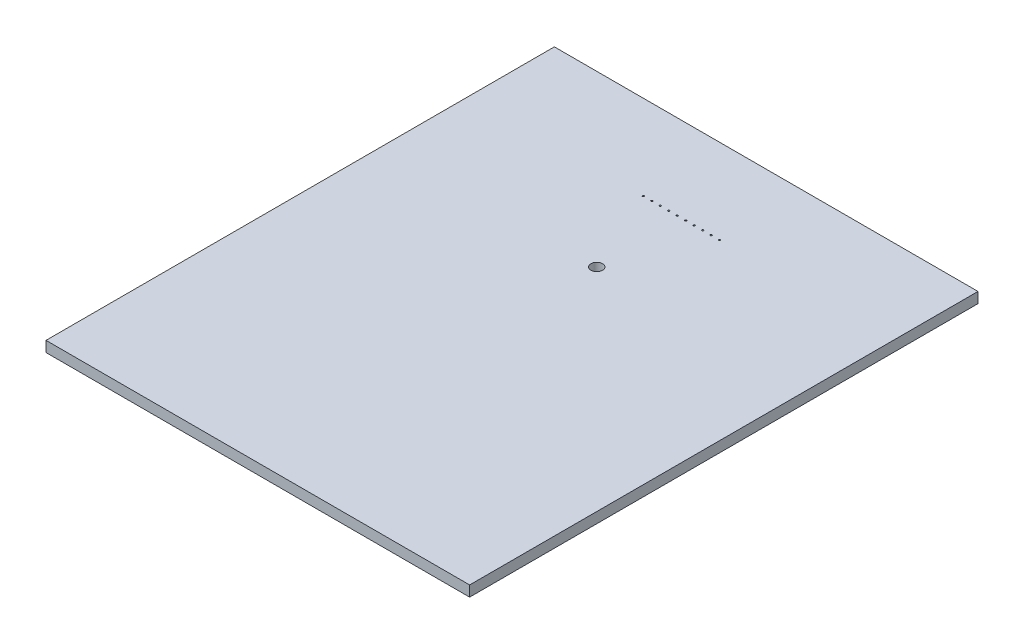
ISO-10303-21;
HEADER;
FILE_DESCRIPTION(('STEP AP214'),'2;1');
FILE_NAME('part.step','',(''),(''),'','','');
FILE_SCHEMA(('AUTOMOTIVE_DESIGN { 1 0 10303 214 1 1 1 1 }'));
ENDSEC;
DATA;
#1=APPLICATION_CONTEXT('core data for automotive mechanical design processes');
#2=APPLICATION_PROTOCOL_DEFINITION('international standard','automotive_design',2000,#1);
#3=PRODUCT_CONTEXT('',#1,'mechanical');
#4=PRODUCT('Part','Part','',(#3));
#5=PRODUCT_RELATED_PRODUCT_CATEGORY('part','',(#4));
#6=PRODUCT_DEFINITION_FORMATION('','',#4);
#7=PRODUCT_DEFINITION_CONTEXT('part definition',#1,'design');
#8=PRODUCT_DEFINITION('design','',#6,#7);
#9=PRODUCT_DEFINITION_SHAPE('','',#8);
#10=(LENGTH_UNIT() NAMED_UNIT(*) SI_UNIT(.MILLI.,.METRE.));
#11=(NAMED_UNIT(*) PLANE_ANGLE_UNIT() SI_UNIT($,.RADIAN.));
#12=(NAMED_UNIT(*) SI_UNIT($,.STERADIAN.) SOLID_ANGLE_UNIT());
#13=UNCERTAINTY_MEASURE_WITH_UNIT(LENGTH_MEASURE(1.E-05),#10,'distance_accuracy_value','');
#14=(GEOMETRIC_REPRESENTATION_CONTEXT(3) GLOBAL_UNCERTAINTY_ASSIGNED_CONTEXT((#13)) GLOBAL_UNIT_ASSIGNED_CONTEXT((#10,
#11,#12)) REPRESENTATION_CONTEXT('',''));
#15=CARTESIAN_POINT('',(0.,0.,0.));
#16=DIRECTION('',(0.,0.,1.));
#17=DIRECTION('',(1.,0.,0.));
#18=AXIS2_PLACEMENT_3D('',#15,#16,#17);
#19=CARTESIAN_POINT('',(0.,3.175,0.));
#20=DIRECTION('',(1.,0.,0.));
#21=DIRECTION('',(0.,0.,-1.));
#22=AXIS2_PLACEMENT_3D('',#19,#20,#21);
#23=PLANE('',#22);
#24=DIRECTION('',(0.,0.,1.));
#25=VECTOR('',#24,1.);
#26=CARTESIAN_POINT('',(0.,0.,0.));
#27=LINE('',#26,#25);
#28=CARTESIAN_POINT('',(0.,0.,-152.4));
#29=VERTEX_POINT('',#28);
#30=CARTESIAN_POINT('',(0.,0.,0.));
#31=VERTEX_POINT('',#30);
#32=EDGE_CURVE('E98',#29,#31,#27,.T.);
#33=ORIENTED_EDGE('',*,*,#32,.T.);
#34=DIRECTION('',(0.,-1.,0.));
#35=VECTOR('',#34,1.);
#36=CARTESIAN_POINT('',(0.,3.175,0.));
#37=LINE('',#36,#35);
#38=CARTESIAN_POINT('',(0.,3.175,0.));
#39=VERTEX_POINT('',#38);
#40=EDGE_CURVE('E11',#39,#31,#37,.T.);
#41=ORIENTED_EDGE('',*,*,#40,.F.);
#42=DIRECTION('',(0.,0.,1.));
#43=VECTOR('',#42,1.);
#44=CARTESIAN_POINT('',(0.,3.175,0.));
#45=LINE('',#44,#43);
#46=CARTESIAN_POINT('',(0.,3.175,-152.4));
#47=VERTEX_POINT('',#46);
#48=EDGE_CURVE('E86',#47,#39,#45,.T.);
#49=ORIENTED_EDGE('',*,*,#48,.F.);
#50=DIRECTION('',(0.,-1.,0.));
#51=VECTOR('',#50,1.);
#52=CARTESIAN_POINT('',(0.,3.175,-152.4));
#53=LINE('',#52,#51);
#54=EDGE_CURVE('E94',#47,#29,#53,.T.);
#55=ORIENTED_EDGE('',*,*,#54,.T.);
#56=EDGE_LOOP('',(#33,#41,#49,#55));
#57=FACE_BOUND('',#56,.T.);
#58=ADVANCED_FACE('F35',(#57),#23,.F.);
#59=CARTESIAN_POINT('',(0.,3.175,0.));
#60=DIRECTION('',(0.,0.,-1.));
#61=DIRECTION('',(-1.,0.,0.));
#62=AXIS2_PLACEMENT_3D('',#59,#60,#61);
#63=PLANE('',#62);
#64=DIRECTION('',(1.,0.,0.));
#65=VECTOR('',#64,1.);
#66=CARTESIAN_POINT('',(0.,0.,0.));
#67=LINE('',#66,#65);
#68=CARTESIAN_POINT('',(127.,0.,0.));
#69=VERTEX_POINT('',#68);
#70=EDGE_CURVE('E90',#31,#69,#67,.T.);
#71=ORIENTED_EDGE('',*,*,#70,.T.);
#72=DIRECTION('',(0.,-1.,0.));
#73=VECTOR('',#72,1.);
#74=CARTESIAN_POINT('',(127.,3.175,0.));
#75=LINE('',#74,#73);
#76=CARTESIAN_POINT('',(127.,3.175,0.));
#77=VERTEX_POINT('',#76);
#78=EDGE_CURVE('E43',#77,#69,#75,.T.);
#79=ORIENTED_EDGE('',*,*,#78,.F.);
#80=DIRECTION('',(1.,0.,0.));
#81=VECTOR('',#80,1.);
#82=CARTESIAN_POINT('',(0.,3.175,0.));
#83=LINE('',#82,#81);
#84=EDGE_CURVE('E81',#39,#77,#83,.T.);
#85=ORIENTED_EDGE('',*,*,#84,.F.);
#86=ORIENTED_EDGE('',*,*,#40,.T.);
#87=EDGE_LOOP('',(#71,#79,#85,#86));
#88=FACE_BOUND('',#87,.T.);
#89=ADVANCED_FACE('F89',(#88),#63,.F.);
#90=CARTESIAN_POINT('',(127.,3.175,0.));
#91=DIRECTION('',(-1.,0.,0.));
#92=DIRECTION('',(0.,0.,1.));
#93=AXIS2_PLACEMENT_3D('',#90,#91,#92);
#94=PLANE('',#93);
#95=DIRECTION('',(0.,0.,-1.));
#96=VECTOR('',#95,1.);
#97=CARTESIAN_POINT('',(127.,0.,0.));
#98=LINE('',#97,#96);
#99=CARTESIAN_POINT('',(127.,0.,-152.4));
#100=VERTEX_POINT('',#99);
#101=EDGE_CURVE('E68',#69,#100,#98,.T.);
#102=ORIENTED_EDGE('',*,*,#101,.T.);
#103=DIRECTION('',(0.,-1.,0.));
#104=VECTOR('',#103,1.);
#105=CARTESIAN_POINT('',(127.,3.175,-152.4));
#106=LINE('',#105,#104);
#107=CARTESIAN_POINT('',(127.,3.175,-152.4));
#108=VERTEX_POINT('',#107);
#109=EDGE_CURVE('E91',#108,#100,#106,.T.);
#110=ORIENTED_EDGE('',*,*,#109,.F.);
#111=DIRECTION('',(0.,0.,-1.));
#112=VECTOR('',#111,1.);
#113=CARTESIAN_POINT('',(127.,3.175,0.));
#114=LINE('',#113,#112);
#115=EDGE_CURVE('E84',#77,#108,#114,.T.);
#116=ORIENTED_EDGE('',*,*,#115,.F.);
#117=ORIENTED_EDGE('',*,*,#78,.T.);
#118=EDGE_LOOP('',(#102,#110,#116,#117));
#119=FACE_BOUND('',#118,.T.);
#120=ADVANCED_FACE('F92',(#119),#94,.F.);
#121=CARTESIAN_POINT('',(0.,3.175,-152.4));
#122=DIRECTION('',(0.,0.,1.));
#123=DIRECTION('',(1.,0.,0.));
#124=AXIS2_PLACEMENT_3D('',#121,#122,#123);
#125=PLANE('',#124);
#126=DIRECTION('',(-1.,0.,0.));
#127=VECTOR('',#126,1.);
#128=CARTESIAN_POINT('',(0.,0.,-152.4));
#129=LINE('',#128,#127);
#130=EDGE_CURVE('E74',#100,#29,#129,.T.);
#131=ORIENTED_EDGE('',*,*,#130,.T.);
#132=ORIENTED_EDGE('',*,*,#54,.F.);
#133=DIRECTION('',(-1.,0.,0.));
#134=VECTOR('',#133,1.);
#135=CARTESIAN_POINT('',(0.,3.175,-152.4));
#136=LINE('',#135,#134);
#137=EDGE_CURVE('E51',#108,#47,#136,.T.);
#138=ORIENTED_EDGE('',*,*,#137,.F.);
#139=ORIENTED_EDGE('',*,*,#109,.T.);
#140=EDGE_LOOP('',(#131,#132,#138,#139));
#141=FACE_BOUND('',#140,.T.);
#142=ADVANCED_FACE('F106',(#141),#125,.F.);
#143=CARTESIAN_POINT('',(0.,3.175,0.));
#144=DIRECTION('',(0.,-1.,0.));
#145=DIRECTION('',(0.,0.,-1.));
#146=AXIS2_PLACEMENT_3D('',#143,#144,#145);
#147=PLANE('',#146);
#148=CARTESIAN_POINT('',(52.07,3.175,-127.));
#149=DIRECTION('',(0.,1.,0.));
#150=DIRECTION('',(0.,0.,1.));
#151=AXIS2_PLACEMENT_3D('',#148,#149,#150);
#152=CIRCLE('',#151,0.246300585078375);
#153=CARTESIAN_POINT('',(52.07,3.175,-126.753699414922));
#154=VERTEX_POINT('',#153);
#155=EDGE_CURVE('E172',#154,#154,#152,.T.);
#156=ORIENTED_EDGE('',*,*,#155,.F.);
#157=EDGE_LOOP('',(#156));
#158=FACE_BOUND('',#157,.T.);
#159=CARTESIAN_POINT('',(54.61,3.175,-127.));
#160=DIRECTION('',(0.,1.,0.));
#161=DIRECTION('',(0.,0.,1.));
#162=AXIS2_PLACEMENT_3D('',#159,#160,#161);
#163=CIRCLE('',#162,0.246300585078375);
#164=CARTESIAN_POINT('',(54.61,3.175,-126.753699414922));
#165=VERTEX_POINT('',#164);
#166=EDGE_CURVE('E166',#165,#165,#163,.T.);
#167=ORIENTED_EDGE('',*,*,#166,.F.);
#168=EDGE_LOOP('',(#167));
#169=FACE_BOUND('',#168,.T.);
#170=CARTESIAN_POINT('',(57.15,3.175,-127.));
#171=DIRECTION('',(0.,1.,0.));
#172=DIRECTION('',(0.,0.,1.));
#173=AXIS2_PLACEMENT_3D('',#170,#171,#172);
#174=CIRCLE('',#173,0.246300585078375);
#175=CARTESIAN_POINT('',(57.15,3.175,-126.753699414922));
#176=VERTEX_POINT('',#175);
#177=EDGE_CURVE('E160',#176,#176,#174,.T.);
#178=ORIENTED_EDGE('',*,*,#177,.F.);
#179=EDGE_LOOP('',(#178));
#180=FACE_BOUND('',#179,.T.);
#181=CARTESIAN_POINT('',(59.69,3.175,-127.));
#182=DIRECTION('',(0.,1.,0.));
#183=DIRECTION('',(0.,0.,1.));
#184=AXIS2_PLACEMENT_3D('',#181,#182,#183);
#185=CIRCLE('',#184,0.246300585078375);
#186=CARTESIAN_POINT('',(59.69,3.175,-126.753699414922));
#187=VERTEX_POINT('',#186);
#188=EDGE_CURVE('E154',#187,#187,#185,.T.);
#189=ORIENTED_EDGE('',*,*,#188,.F.);
#190=EDGE_LOOP('',(#189));
#191=FACE_BOUND('',#190,.T.);
#192=CARTESIAN_POINT('',(62.23,3.175,-127.));
#193=DIRECTION('',(0.,1.,0.));
#194=DIRECTION('',(0.,0.,1.));
#195=AXIS2_PLACEMENT_3D('',#192,#193,#194);
#196=CIRCLE('',#195,0.246300585078375);
#197=CARTESIAN_POINT('',(62.23,3.175,-126.753699414922));
#198=VERTEX_POINT('',#197);
#199=EDGE_CURVE('E148',#198,#198,#196,.T.);
#200=ORIENTED_EDGE('',*,*,#199,.F.);
#201=EDGE_LOOP('',(#200));
#202=FACE_BOUND('',#201,.T.);
#203=CARTESIAN_POINT('',(64.77,3.175,-127.));
#204=DIRECTION('',(0.,1.,0.));
#205=DIRECTION('',(0.,0.,1.));
#206=AXIS2_PLACEMENT_3D('',#203,#204,#205);
#207=CIRCLE('',#206,0.246300585078375);
#208=CARTESIAN_POINT('',(64.77,3.175,-126.753699414922));
#209=VERTEX_POINT('',#208);
#210=EDGE_CURVE('E142',#209,#209,#207,.T.);
#211=ORIENTED_EDGE('',*,*,#210,.F.);
#212=EDGE_LOOP('',(#211));
#213=FACE_BOUND('',#212,.T.);
#214=CARTESIAN_POINT('',(67.31,3.175,-127.));
#215=DIRECTION('',(0.,1.,0.));
#216=DIRECTION('',(0.,0.,1.));
#217=AXIS2_PLACEMENT_3D('',#214,#215,#216);
#218=CIRCLE('',#217,0.246300585078375);
#219=CARTESIAN_POINT('',(67.31,3.175,-126.753699414922));
#220=VERTEX_POINT('',#219);
#221=EDGE_CURVE('E136',#220,#220,#218,.T.);
#222=ORIENTED_EDGE('',*,*,#221,.F.);
#223=EDGE_LOOP('',(#222));
#224=FACE_BOUND('',#223,.T.);
#225=CARTESIAN_POINT('',(69.85,3.175,-127.));
#226=DIRECTION('',(0.,1.,0.));
#227=DIRECTION('',(0.,0.,1.));
#228=AXIS2_PLACEMENT_3D('',#225,#226,#227);
#229=CIRCLE('',#228,0.246300585078375);
#230=CARTESIAN_POINT('',(69.85,3.175,-126.753699414922));
#231=VERTEX_POINT('',#230);
#232=EDGE_CURVE('E130',#231,#231,#229,.T.);
#233=ORIENTED_EDGE('',*,*,#232,.F.);
#234=EDGE_LOOP('',(#233));
#235=FACE_BOUND('',#234,.T.);
#236=CARTESIAN_POINT('',(72.39,3.175,-127.));
#237=DIRECTION('',(0.,1.,0.));
#238=DIRECTION('',(0.,0.,1.));
#239=AXIS2_PLACEMENT_3D('',#236,#237,#238);
#240=CIRCLE('',#239,0.246300585078375);
#241=CARTESIAN_POINT('',(72.39,3.175,-126.753699414922));
#242=VERTEX_POINT('',#241);
#243=EDGE_CURVE('E124',#242,#242,#240,.T.);
#244=ORIENTED_EDGE('',*,*,#243,.F.);
#245=EDGE_LOOP('',(#244));
#246=FACE_BOUND('',#245,.T.);
#247=CARTESIAN_POINT('',(74.93,3.175,-127.));
#248=DIRECTION('',(0.,1.,0.));
#249=DIRECTION('',(0.,0.,1.));
#250=AXIS2_PLACEMENT_3D('',#247,#248,#249);
#251=CIRCLE('',#250,0.246300585078375);
#252=CARTESIAN_POINT('',(74.93,3.175,-126.753699414922));
#253=VERTEX_POINT('',#252);
#254=EDGE_CURVE('E118',#253,#253,#251,.T.);
#255=ORIENTED_EDGE('',*,*,#254,.F.);
#256=EDGE_LOOP('',(#255));
#257=FACE_BOUND('',#256,.T.);
#258=CARTESIAN_POINT('',(63.5,3.175,-101.6));
#259=DIRECTION('',(0.,1.,0.));
#260=DIRECTION('',(0.,0.,1.));
#261=AXIS2_PLACEMENT_3D('',#258,#259,#260);
#262=CIRCLE('',#261,1.72719999999998);
#263=CARTESIAN_POINT('',(63.5,3.175,-99.8728));
#264=VERTEX_POINT('',#263);
#265=EDGE_CURVE('E114',#264,#264,#262,.T.);
#266=ORIENTED_EDGE('',*,*,#265,.F.);
#267=EDGE_LOOP('',(#266));
#268=FACE_BOUND('',#267,.T.);
#269=ORIENTED_EDGE('',*,*,#48,.T.);
#270=ORIENTED_EDGE('',*,*,#84,.T.);
#271=ORIENTED_EDGE('',*,*,#115,.T.);
#272=ORIENTED_EDGE('',*,*,#137,.T.);
#273=EDGE_LOOP('',(#269,#270,#271,#272));
#274=FACE_BOUND('',#273,.T.);
#275=ADVANCED_FACE('F82',(#158,#169,#180,#191,#202,#213,#224,#235,#246,#257,#268,#274),#147,.F.);
#276=CARTESIAN_POINT('',(0.,0.,0.));
#277=DIRECTION('',(0.,-1.,0.));
#278=DIRECTION('',(0.,0.,-1.));
#279=AXIS2_PLACEMENT_3D('',#276,#277,#278);
#280=PLANE('',#279);
#281=CARTESIAN_POINT('',(52.07,0.,-127.));
#282=DIRECTION('',(0.,1.,0.));
#283=DIRECTION('',(0.,0.,1.));
#284=AXIS2_PLACEMENT_3D('',#281,#282,#283);
#285=CIRCLE('',#284,0.246300585078375);
#286=CARTESIAN_POINT('',(52.07,0.,-126.753699414922));
#287=VERTEX_POINT('',#286);
#288=EDGE_CURVE('E117',#287,#287,#285,.T.);
#289=ORIENTED_EDGE('',*,*,#288,.T.);
#290=EDGE_LOOP('',(#289));
#291=FACE_BOUND('',#290,.T.);
#292=CARTESIAN_POINT('',(54.61,0.,-127.));
#293=DIRECTION('',(0.,1.,0.));
#294=DIRECTION('',(0.,0.,1.));
#295=AXIS2_PLACEMENT_3D('',#292,#293,#294);
#296=CIRCLE('',#295,0.246300585078375);
#297=CARTESIAN_POINT('',(54.61,0.,-126.753699414922));
#298=VERTEX_POINT('',#297);
#299=EDGE_CURVE('E169',#298,#298,#296,.T.);
#300=ORIENTED_EDGE('',*,*,#299,.T.);
#301=EDGE_LOOP('',(#300));
#302=FACE_BOUND('',#301,.T.);
#303=CARTESIAN_POINT('',(57.15,0.,-127.));
#304=DIRECTION('',(0.,1.,0.));
#305=DIRECTION('',(0.,0.,1.));
#306=AXIS2_PLACEMENT_3D('',#303,#304,#305);
#307=CIRCLE('',#306,0.246300585078375);
#308=CARTESIAN_POINT('',(57.15,0.,-126.753699414922));
#309=VERTEX_POINT('',#308);
#310=EDGE_CURVE('E163',#309,#309,#307,.T.);
#311=ORIENTED_EDGE('',*,*,#310,.T.);
#312=EDGE_LOOP('',(#311));
#313=FACE_BOUND('',#312,.T.);
#314=CARTESIAN_POINT('',(59.69,0.,-127.));
#315=DIRECTION('',(0.,1.,0.));
#316=DIRECTION('',(0.,0.,1.));
#317=AXIS2_PLACEMENT_3D('',#314,#315,#316);
#318=CIRCLE('',#317,0.246300585078375);
#319=CARTESIAN_POINT('',(59.69,0.,-126.753699414922));
#320=VERTEX_POINT('',#319);
#321=EDGE_CURVE('E157',#320,#320,#318,.T.);
#322=ORIENTED_EDGE('',*,*,#321,.T.);
#323=EDGE_LOOP('',(#322));
#324=FACE_BOUND('',#323,.T.);
#325=CARTESIAN_POINT('',(62.23,0.,-127.));
#326=DIRECTION('',(0.,1.,0.));
#327=DIRECTION('',(0.,0.,1.));
#328=AXIS2_PLACEMENT_3D('',#325,#326,#327);
#329=CIRCLE('',#328,0.246300585078375);
#330=CARTESIAN_POINT('',(62.23,0.,-126.753699414922));
#331=VERTEX_POINT('',#330);
#332=EDGE_CURVE('E151',#331,#331,#329,.T.);
#333=ORIENTED_EDGE('',*,*,#332,.T.);
#334=EDGE_LOOP('',(#333));
#335=FACE_BOUND('',#334,.T.);
#336=CARTESIAN_POINT('',(64.77,0.,-127.));
#337=DIRECTION('',(0.,1.,0.));
#338=DIRECTION('',(0.,0.,1.));
#339=AXIS2_PLACEMENT_3D('',#336,#337,#338);
#340=CIRCLE('',#339,0.246300585078375);
#341=CARTESIAN_POINT('',(64.77,0.,-126.753699414922));
#342=VERTEX_POINT('',#341);
#343=EDGE_CURVE('E145',#342,#342,#340,.T.);
#344=ORIENTED_EDGE('',*,*,#343,.T.);
#345=EDGE_LOOP('',(#344));
#346=FACE_BOUND('',#345,.T.);
#347=CARTESIAN_POINT('',(67.31,0.,-127.));
#348=DIRECTION('',(0.,1.,0.));
#349=DIRECTION('',(0.,0.,1.));
#350=AXIS2_PLACEMENT_3D('',#347,#348,#349);
#351=CIRCLE('',#350,0.246300585078375);
#352=CARTESIAN_POINT('',(67.31,0.,-126.753699414922));
#353=VERTEX_POINT('',#352);
#354=EDGE_CURVE('E139',#353,#353,#351,.T.);
#355=ORIENTED_EDGE('',*,*,#354,.T.);
#356=EDGE_LOOP('',(#355));
#357=FACE_BOUND('',#356,.T.);
#358=CARTESIAN_POINT('',(69.85,0.,-127.));
#359=DIRECTION('',(0.,1.,0.));
#360=DIRECTION('',(0.,0.,1.));
#361=AXIS2_PLACEMENT_3D('',#358,#359,#360);
#362=CIRCLE('',#361,0.246300585078375);
#363=CARTESIAN_POINT('',(69.85,0.,-126.753699414922));
#364=VERTEX_POINT('',#363);
#365=EDGE_CURVE('E133',#364,#364,#362,.T.);
#366=ORIENTED_EDGE('',*,*,#365,.T.);
#367=EDGE_LOOP('',(#366));
#368=FACE_BOUND('',#367,.T.);
#369=CARTESIAN_POINT('',(72.39,0.,-127.));
#370=DIRECTION('',(0.,1.,0.));
#371=DIRECTION('',(0.,0.,1.));
#372=AXIS2_PLACEMENT_3D('',#369,#370,#371);
#373=CIRCLE('',#372,0.246300585078375);
#374=CARTESIAN_POINT('',(72.39,0.,-126.753699414922));
#375=VERTEX_POINT('',#374);
#376=EDGE_CURVE('E127',#375,#375,#373,.T.);
#377=ORIENTED_EDGE('',*,*,#376,.T.);
#378=EDGE_LOOP('',(#377));
#379=FACE_BOUND('',#378,.T.);
#380=CARTESIAN_POINT('',(74.93,0.,-127.));
#381=DIRECTION('',(0.,1.,0.));
#382=DIRECTION('',(0.,0.,1.));
#383=AXIS2_PLACEMENT_3D('',#380,#381,#382);
#384=CIRCLE('',#383,0.246300585078375);
#385=CARTESIAN_POINT('',(74.93,0.,-126.753699414922));
#386=VERTEX_POINT('',#385);
#387=EDGE_CURVE('E121',#386,#386,#384,.T.);
#388=ORIENTED_EDGE('',*,*,#387,.T.);
#389=EDGE_LOOP('',(#388));
#390=FACE_BOUND('',#389,.T.);
#391=CARTESIAN_POINT('',(63.5,0.,-101.6));
#392=DIRECTION('',(0.,1.,0.));
#393=DIRECTION('',(0.,0.,1.));
#394=AXIS2_PLACEMENT_3D('',#391,#392,#393);
#395=CIRCLE('',#394,1.7272);
#396=CARTESIAN_POINT('',(63.5,0.,-99.8728));
#397=VERTEX_POINT('',#396);
#398=EDGE_CURVE('E101',#397,#397,#395,.T.);
#399=ORIENTED_EDGE('',*,*,#398,.T.);
#400=EDGE_LOOP('',(#399));
#401=FACE_BOUND('',#400,.T.);
#402=ORIENTED_EDGE('',*,*,#32,.F.);
#403=ORIENTED_EDGE('',*,*,#130,.F.);
#404=ORIENTED_EDGE('',*,*,#101,.F.);
#405=ORIENTED_EDGE('',*,*,#70,.F.);
#406=EDGE_LOOP('',(#402,#403,#404,#405));
#407=FACE_BOUND('',#406,.T.);
#408=ADVANCED_FACE('F109',(#291,#302,#313,#324,#335,#346,#357,#368,#379,#390,#401,#407),#280,.T.);
#409=CARTESIAN_POINT('',(63.5,3.175,-101.6));
#410=DIRECTION('',(0.,1.,0.));
#411=DIRECTION('',(0.,0.,1.));
#412=AXIS2_PLACEMENT_3D('',#409,#410,#411);
#413=CYLINDRICAL_SURFACE('',#412,1.72719999999999);
#414=ORIENTED_EDGE('',*,*,#398,.F.);
#415=EDGE_LOOP('',(#414));
#416=FACE_BOUND('',#415,.T.);
#417=ORIENTED_EDGE('',*,*,#265,.T.);
#418=EDGE_LOOP('',(#417));
#419=FACE_BOUND('',#418,.T.);
#420=ADVANCED_FACE('F210',(#416,#419),#413,.F.);
#421=CARTESIAN_POINT('',(74.93,0.,-127.));
#422=DIRECTION('',(0.,1.,0.));
#423=DIRECTION('',(0.,0.,1.));
#424=AXIS2_PLACEMENT_3D('',#421,#422,#423);
#425=CYLINDRICAL_SURFACE('',#424,0.246300585078375);
#426=ORIENTED_EDGE('',*,*,#387,.F.);
#427=EDGE_LOOP('',(#426));
#428=FACE_BOUND('',#427,.T.);
#429=ORIENTED_EDGE('',*,*,#254,.T.);
#430=EDGE_LOOP('',(#429));
#431=FACE_BOUND('',#430,.T.);
#432=ADVANCED_FACE('F212',(#428,#431),#425,.F.);
#433=CARTESIAN_POINT('',(72.39,0.,-127.));
#434=DIRECTION('',(0.,1.,0.));
#435=DIRECTION('',(0.,0.,1.));
#436=AXIS2_PLACEMENT_3D('',#433,#434,#435);
#437=CYLINDRICAL_SURFACE('',#436,0.246300585078375);
#438=ORIENTED_EDGE('',*,*,#376,.F.);
#439=EDGE_LOOP('',(#438));
#440=FACE_BOUND('',#439,.T.);
#441=ORIENTED_EDGE('',*,*,#243,.T.);
#442=EDGE_LOOP('',(#441));
#443=FACE_BOUND('',#442,.T.);
#444=ADVANCED_FACE('F219',(#440,#443),#437,.F.);
#445=CARTESIAN_POINT('',(69.85,0.,-127.));
#446=DIRECTION('',(0.,1.,0.));
#447=DIRECTION('',(0.,0.,1.));
#448=AXIS2_PLACEMENT_3D('',#445,#446,#447);
#449=CYLINDRICAL_SURFACE('',#448,0.246300585078375);
#450=ORIENTED_EDGE('',*,*,#365,.F.);
#451=EDGE_LOOP('',(#450));
#452=FACE_BOUND('',#451,.T.);
#453=ORIENTED_EDGE('',*,*,#232,.T.);
#454=EDGE_LOOP('',(#453));
#455=FACE_BOUND('',#454,.T.);
#456=ADVANCED_FACE('F265',(#452,#455),#449,.F.);
#457=CARTESIAN_POINT('',(67.31,0.,-127.));
#458=DIRECTION('',(0.,1.,0.));
#459=DIRECTION('',(0.,0.,1.));
#460=AXIS2_PLACEMENT_3D('',#457,#458,#459);
#461=CYLINDRICAL_SURFACE('',#460,0.246300585078375);
#462=ORIENTED_EDGE('',*,*,#354,.F.);
#463=EDGE_LOOP('',(#462));
#464=FACE_BOUND('',#463,.T.);
#465=ORIENTED_EDGE('',*,*,#221,.T.);
#466=EDGE_LOOP('',(#465));
#467=FACE_BOUND('',#466,.T.);
#468=ADVANCED_FACE('F275',(#464,#467),#461,.F.);
#469=CARTESIAN_POINT('',(64.77,0.,-127.));
#470=DIRECTION('',(0.,1.,0.));
#471=DIRECTION('',(0.,0.,1.));
#472=AXIS2_PLACEMENT_3D('',#469,#470,#471);
#473=CYLINDRICAL_SURFACE('',#472,0.246300585078375);
#474=ORIENTED_EDGE('',*,*,#343,.F.);
#475=EDGE_LOOP('',(#474));
#476=FACE_BOUND('',#475,.T.);
#477=ORIENTED_EDGE('',*,*,#210,.T.);
#478=EDGE_LOOP('',(#477));
#479=FACE_BOUND('',#478,.T.);
#480=ADVANCED_FACE('F285',(#476,#479),#473,.F.);
#481=CARTESIAN_POINT('',(62.23,0.,-127.));
#482=DIRECTION('',(0.,1.,0.));
#483=DIRECTION('',(0.,0.,1.));
#484=AXIS2_PLACEMENT_3D('',#481,#482,#483);
#485=CYLINDRICAL_SURFACE('',#484,0.246300585078375);
#486=ORIENTED_EDGE('',*,*,#332,.F.);
#487=EDGE_LOOP('',(#486));
#488=FACE_BOUND('',#487,.T.);
#489=ORIENTED_EDGE('',*,*,#199,.T.);
#490=EDGE_LOOP('',(#489));
#491=FACE_BOUND('',#490,.T.);
#492=ADVANCED_FACE('F295',(#488,#491),#485,.F.);
#493=CARTESIAN_POINT('',(59.69,0.,-127.));
#494=DIRECTION('',(0.,1.,0.));
#495=DIRECTION('',(0.,0.,1.));
#496=AXIS2_PLACEMENT_3D('',#493,#494,#495);
#497=CYLINDRICAL_SURFACE('',#496,0.246300585078375);
#498=ORIENTED_EDGE('',*,*,#321,.F.);
#499=EDGE_LOOP('',(#498));
#500=FACE_BOUND('',#499,.T.);
#501=ORIENTED_EDGE('',*,*,#188,.T.);
#502=EDGE_LOOP('',(#501));
#503=FACE_BOUND('',#502,.T.);
#504=ADVANCED_FACE('F305',(#500,#503),#497,.F.);
#505=CARTESIAN_POINT('',(57.15,0.,-127.));
#506=DIRECTION('',(0.,1.,0.));
#507=DIRECTION('',(0.,0.,1.));
#508=AXIS2_PLACEMENT_3D('',#505,#506,#507);
#509=CYLINDRICAL_SURFACE('',#508,0.246300585078375);
#510=ORIENTED_EDGE('',*,*,#310,.F.);
#511=EDGE_LOOP('',(#510));
#512=FACE_BOUND('',#511,.T.);
#513=ORIENTED_EDGE('',*,*,#177,.T.);
#514=EDGE_LOOP('',(#513));
#515=FACE_BOUND('',#514,.T.);
#516=ADVANCED_FACE('F315',(#512,#515),#509,.F.);
#517=CARTESIAN_POINT('',(54.61,0.,-127.));
#518=DIRECTION('',(0.,1.,0.));
#519=DIRECTION('',(0.,0.,1.));
#520=AXIS2_PLACEMENT_3D('',#517,#518,#519);
#521=CYLINDRICAL_SURFACE('',#520,0.246300585078375);
#522=ORIENTED_EDGE('',*,*,#299,.F.);
#523=EDGE_LOOP('',(#522));
#524=FACE_BOUND('',#523,.T.);
#525=ORIENTED_EDGE('',*,*,#166,.T.);
#526=EDGE_LOOP('',(#525));
#527=FACE_BOUND('',#526,.T.);
#528=ADVANCED_FACE('F183',(#524,#527),#521,.F.);
#529=CARTESIAN_POINT('',(52.07,0.,-127.));
#530=DIRECTION('',(0.,1.,0.));
#531=DIRECTION('',(0.,0.,1.));
#532=AXIS2_PLACEMENT_3D('',#529,#530,#531);
#533=CYLINDRICAL_SURFACE('',#532,0.246300585078375);
#534=ORIENTED_EDGE('',*,*,#288,.F.);
#535=EDGE_LOOP('',(#534));
#536=FACE_BOUND('',#535,.T.);
#537=ORIENTED_EDGE('',*,*,#155,.T.);
#538=EDGE_LOOP('',(#537));
#539=FACE_BOUND('',#538,.T.);
#540=ADVANCED_FACE('F180',(#536,#539),#533,.F.);
#541=CLOSED_SHELL('',(#58,#89,#120,#142,#275,#408,#420,#432,#444,#456,#468,#480,#492,#504,#516,
#528,#540));
#542=MANIFOLD_SOLID_BREP('B2',#541);
#543=ADVANCED_BREP_SHAPE_REPRESENTATION('',(#18,#542),#14);
#544=SHAPE_DEFINITION_REPRESENTATION(#9,#543);
ENDSEC;
END-ISO-10303-21;
